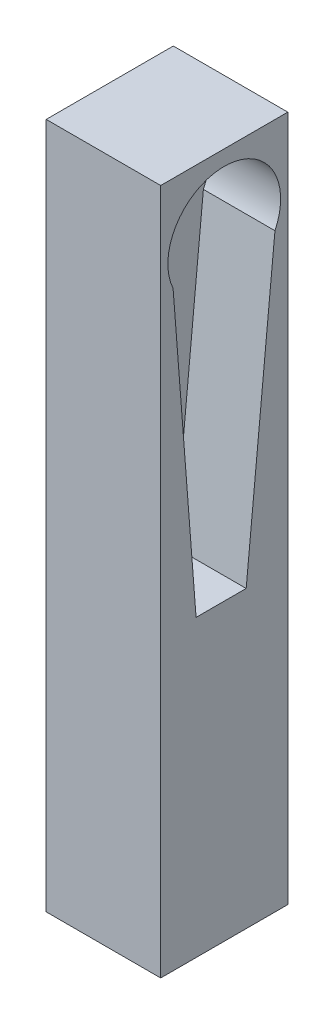
ISO-10303-21;
HEADER;
FILE_DESCRIPTION(('STEP AP214'),'2;1');
FILE_NAME('part.step','',(''),(''),'','','');
FILE_SCHEMA(('AUTOMOTIVE_DESIGN { 1 0 10303 214 1 1 1 1 }'));
ENDSEC;
DATA;
#1=APPLICATION_CONTEXT('core data for automotive mechanical design processes');
#2=APPLICATION_PROTOCOL_DEFINITION('international standard','automotive_design',2000,#1);
#3=PRODUCT_CONTEXT('',#1,'mechanical');
#4=PRODUCT('Part','Part','',(#3));
#5=PRODUCT_RELATED_PRODUCT_CATEGORY('part','',(#4));
#6=PRODUCT_DEFINITION_FORMATION('','',#4);
#7=PRODUCT_DEFINITION_CONTEXT('part definition',#1,'design');
#8=PRODUCT_DEFINITION('design','',#6,#7);
#9=PRODUCT_DEFINITION_SHAPE('','',#8);
#10=(LENGTH_UNIT() NAMED_UNIT(*) SI_UNIT(.MILLI.,.METRE.));
#11=(NAMED_UNIT(*) PLANE_ANGLE_UNIT() SI_UNIT($,.RADIAN.));
#12=(NAMED_UNIT(*) SI_UNIT($,.STERADIAN.) SOLID_ANGLE_UNIT());
#13=UNCERTAINTY_MEASURE_WITH_UNIT(LENGTH_MEASURE(1.E-05),#10,'distance_accuracy_value','');
#14=(GEOMETRIC_REPRESENTATION_CONTEXT(3) GLOBAL_UNCERTAINTY_ASSIGNED_CONTEXT((#13)) GLOBAL_UNIT_ASSIGNED_CONTEXT((#10,
#11,#12)) REPRESENTATION_CONTEXT('',''));
#15=CARTESIAN_POINT('',(0.,0.,0.));
#16=DIRECTION('',(0.,0.,1.));
#17=DIRECTION('',(1.,0.,0.));
#18=AXIS2_PLACEMENT_3D('',#15,#16,#17);
#19=CARTESIAN_POINT('',(8.,-0.285657863573996,3.68145381554616));
#20=DIRECTION('',(0.,0.0773612269140107,-0.99700312966929));
#21=DIRECTION('',(0.,0.99700312966929,0.0773612269140107));
#22=AXIS2_PLACEMENT_3D('',#19,#20,#21);
#23=PLANE('',#22);
#24=DIRECTION('',(0.,-0.99700312966929,-0.0773612269140107));
#25=VECTOR('',#24,1.);
#26=CARTESIAN_POINT('',(3.,-0.285657863573996,3.68145381554616));
#27=LINE('',#26,#25);
#28=CARTESIAN_POINT('',(3.,-1.6553290300342,3.57517587242551));
#29=VERTEX_POINT('',#28);
#30=CARTESIAN_POINT('',(3.,-22.3642227088041,1.96829483529892));
#31=VERTEX_POINT('',#30);
#32=EDGE_CURVE('E89',#29,#31,#27,.T.);
#33=ORIENTED_EDGE('',*,*,#32,.F.);
#34=DIRECTION('',(-1.,0.,0.));
#35=VECTOR('',#34,1.);
#36=CARTESIAN_POINT('',(8.,-1.6553290300342,3.57517587242551));
#37=LINE('',#36,#35);
#38=CARTESIAN_POINT('',(8.,-1.6553290300342,3.57517587242551));
#39=VERTEX_POINT('',#38);
#40=EDGE_CURVE('E12',#39,#29,#37,.T.);
#41=ORIENTED_EDGE('',*,*,#40,.F.);
#42=DIRECTION('',(0.,-0.99700312966929,-0.0773612269140107));
#43=VECTOR('',#42,1.);
#44=CARTESIAN_POINT('',(8.,-0.285657863573996,3.68145381554616));
#45=LINE('',#44,#43);
#46=CARTESIAN_POINT('',(8.,-22.3642227088041,1.96829483529892));
#47=VERTEX_POINT('',#46);
#48=EDGE_CURVE('E196',#39,#47,#45,.T.);
#49=ORIENTED_EDGE('',*,*,#48,.T.);
#50=DIRECTION('',(-1.,0.,0.));
#51=VECTOR('',#50,1.);
#52=CARTESIAN_POINT('',(8.,-22.3642227088041,1.96829483529892));
#53=LINE('',#52,#51);
#54=EDGE_CURVE('E207',#47,#31,#53,.T.);
#55=ORIENTED_EDGE('',*,*,#54,.T.);
#56=EDGE_LOOP('',(#33,#41,#49,#55));
#57=FACE_BOUND('',#56,.T.);
#58=ADVANCED_FACE('F75',(#57),#23,.T.);
#59=CARTESIAN_POINT('',(8.,0.,0.));
#60=DIRECTION('',(-1.,0.,0.));
#61=DIRECTION('',(0.,0.,1.));
#62=AXIS2_PLACEMENT_3D('',#59,#60,#61);
#63=CYLINDRICAL_SURFACE('',#62,3.93979653236655);
#64=ORIENTED_EDGE('',*,*,#40,.T.);
#65=CARTESIAN_POINT('',(3.,0.,0.));
#66=DIRECTION('',(1.,0.,0.));
#67=DIRECTION('',(0.,0.,-1.));
#68=AXIS2_PLACEMENT_3D('',#65,#66,#67);
#69=CIRCLE('',#68,3.93979653236655);
#70=CARTESIAN_POINT('',(3.,-1.72527742243439,-3.54195066765273));
#71=VERTEX_POINT('',#70);
#72=EDGE_CURVE('E184',#29,#71,#69,.F.);
#73=ORIENTED_EDGE('',*,*,#72,.T.);
#74=DIRECTION('',(-1.,0.,0.));
#75=VECTOR('',#74,1.);
#76=CARTESIAN_POINT('',(8.,-1.72527742243439,-3.54195066765273));
#77=LINE('',#76,#75);
#78=CARTESIAN_POINT('',(8.,-1.72527742243439,-3.54195066765273));
#79=VERTEX_POINT('',#78);
#80=EDGE_CURVE('E82',#79,#71,#77,.T.);
#81=ORIENTED_EDGE('',*,*,#80,.F.);
#82=CARTESIAN_POINT('',(8.,0.,0.));
#83=DIRECTION('',(1.,0.,0.));
#84=DIRECTION('',(0.,0.,-1.));
#85=AXIS2_PLACEMENT_3D('',#82,#83,#84);
#86=CIRCLE('',#85,3.93979653236655);
#87=EDGE_CURVE('E201',#39,#79,#86,.F.);
#88=ORIENTED_EDGE('',*,*,#87,.F.);
#89=EDGE_LOOP('',(#64,#73,#81,#88));
#90=FACE_BOUND('',#89,.T.);
#91=ADVANCED_FACE('F219',(#90),#63,.F.);
#92=CARTESIAN_POINT('',(8.,-0.357959667477983,-3.67512822735208));
#93=DIRECTION('',(0.,-0.096941840547844,-0.995290047951448));
#94=DIRECTION('',(0.,0.995290047951448,-0.096941840547844));
#95=AXIS2_PLACEMENT_3D('',#92,#93,#94);
#96=PLANE('',#95);
#97=ORIENTED_EDGE('',*,*,#80,.T.);
#98=DIRECTION('',(0.,-0.995290047951448,0.096941840547844));
#99=VECTOR('',#98,1.);
#100=CARTESIAN_POINT('',(3.,-0.357959667477983,-3.67512822735208));
#101=LINE('',#100,#99);
#102=CARTESIAN_POINT('',(3.,-22.3642227088041,-1.53170516470108));
#103=VERTEX_POINT('',#102);
#104=EDGE_CURVE('E190',#71,#103,#101,.T.);
#105=ORIENTED_EDGE('',*,*,#104,.T.);
#106=DIRECTION('',(-1.,0.,0.));
#107=VECTOR('',#106,1.);
#108=CARTESIAN_POINT('',(8.,-22.3642227088041,-1.53170516470108));
#109=LINE('',#108,#107);
#110=CARTESIAN_POINT('',(8.,-22.3642227088041,-1.53170516470108));
#111=VERTEX_POINT('',#110);
#112=EDGE_CURVE('E210',#111,#103,#109,.T.);
#113=ORIENTED_EDGE('',*,*,#112,.F.);
#114=DIRECTION('',(0.,-0.995290047951448,0.096941840547844));
#115=VECTOR('',#114,1.);
#116=CARTESIAN_POINT('',(8.,-0.357959667477983,-3.67512822735208));
#117=LINE('',#116,#115);
#118=EDGE_CURVE('E204',#79,#111,#117,.T.);
#119=ORIENTED_EDGE('',*,*,#118,.F.);
#120=EDGE_LOOP('',(#97,#105,#113,#119));
#121=FACE_BOUND('',#120,.T.);
#122=ADVANCED_FACE('F215',(#121),#96,.F.);
#123=CARTESIAN_POINT('',(8.,-22.3642227088041,0.));
#124=DIRECTION('',(0.,-1.,0.));
#125=DIRECTION('',(0.,0.,-1.));
#126=AXIS2_PLACEMENT_3D('',#123,#124,#125);
#127=PLANE('',#126);
#128=ORIENTED_EDGE('',*,*,#112,.T.);
#129=DIRECTION('',(0.,0.,1.));
#130=VECTOR('',#129,1.);
#131=CARTESIAN_POINT('',(3.,-22.3642227088041,0.));
#132=LINE('',#131,#130);
#133=EDGE_CURVE('E188',#103,#31,#132,.T.);
#134=ORIENTED_EDGE('',*,*,#133,.T.);
#135=ORIENTED_EDGE('',*,*,#54,.F.);
#136=DIRECTION('',(0.,0.,1.));
#137=VECTOR('',#136,1.);
#138=CARTESIAN_POINT('',(8.,-22.3642227088041,0.));
#139=LINE('',#138,#137);
#140=EDGE_CURVE('E97',#111,#47,#139,.T.);
#141=ORIENTED_EDGE('',*,*,#140,.F.);
#142=EDGE_LOOP('',(#128,#134,#135,#141));
#143=FACE_BOUND('',#142,.T.);
#144=ADVANCED_FACE('F224',(#143),#127,.F.);
#145=CARTESIAN_POINT('',(8.,0.,0.));
#146=DIRECTION('',(1.,0.,0.));
#147=DIRECTION('',(0.,0.,-1.));
#148=AXIS2_PLACEMENT_3D('',#145,#146,#147);
#149=PLANE('',#148);
#150=DIRECTION('',(0.,-1.,0.));
#151=VECTOR('',#150,1.);
#152=CARTESIAN_POINT('',(8.,0.,-4.43979653236655));
#153=LINE('',#152,#151);
#154=CARTESIAN_POINT('',(8.,5.00036123251668,-4.43979653236655));
#155=VERTEX_POINT('',#154);
#156=CARTESIAN_POINT('',(8.,-42.9467631339565,-4.43979653236655));
#157=VERTEX_POINT('',#156);
#158=EDGE_CURVE('E167',#155,#157,#153,.T.);
#159=ORIENTED_EDGE('',*,*,#158,.F.);
#160=DIRECTION('',(0.,0.,-1.));
#161=VECTOR('',#160,1.);
#162=CARTESIAN_POINT('',(8.,5.00036123251668,0.));
#163=LINE('',#162,#161);
#164=CARTESIAN_POINT('',(8.,5.00036123251668,4.43979653236654));
#165=VERTEX_POINT('',#164);
#166=EDGE_CURVE('E166',#165,#155,#163,.T.);
#167=ORIENTED_EDGE('',*,*,#166,.F.);
#168=DIRECTION('',(0.,-1.,0.));
#169=VECTOR('',#168,1.);
#170=CARTESIAN_POINT('',(8.,0.,4.43979653236654));
#171=LINE('',#170,#169);
#172=CARTESIAN_POINT('',(8.,-42.9467631339565,4.43979653236654));
#173=VERTEX_POINT('',#172);
#174=EDGE_CURVE('E169',#165,#173,#171,.T.);
#175=ORIENTED_EDGE('',*,*,#174,.T.);
#176=DIRECTION('',(0.,0.,-1.));
#177=VECTOR('',#176,1.);
#178=CARTESIAN_POINT('',(8.,-42.9467631339565,0.));
#179=LINE('',#178,#177);
#180=EDGE_CURVE('E178',#173,#157,#179,.T.);
#181=ORIENTED_EDGE('',*,*,#180,.T.);
#182=EDGE_LOOP('',(#159,#167,#175,#181));
#183=FACE_BOUND('',#182,.T.);
#184=ORIENTED_EDGE('',*,*,#48,.F.);
#185=ORIENTED_EDGE('',*,*,#87,.T.);
#186=ORIENTED_EDGE('',*,*,#118,.T.);
#187=ORIENTED_EDGE('',*,*,#140,.T.);
#188=EDGE_LOOP('',(#184,#185,#186,#187));
#189=FACE_BOUND('',#188,.T.);
#190=ADVANCED_FACE('F225',(#183,#189),#149,.T.);
#191=CARTESIAN_POINT('',(0.,0.,0.));
#192=DIRECTION('',(1.,0.,0.));
#193=DIRECTION('',(0.,0.,-1.));
#194=AXIS2_PLACEMENT_3D('',#191,#192,#193);
#195=PLANE('',#194);
#196=DIRECTION('',(0.,1.,0.));
#197=VECTOR('',#196,1.);
#198=CARTESIAN_POINT('',(0.,0.,4.43979653236654));
#199=LINE('',#198,#197);
#200=CARTESIAN_POINT('',(0.,-42.9467631339565,4.43979653236654));
#201=VERTEX_POINT('',#200);
#202=CARTESIAN_POINT('',(0.,5.00036123251668,4.43979653236654));
#203=VERTEX_POINT('',#202);
#204=EDGE_CURVE('E158',#201,#203,#199,.T.);
#205=ORIENTED_EDGE('',*,*,#204,.T.);
#206=DIRECTION('',(0.,0.,1.));
#207=VECTOR('',#206,1.);
#208=CARTESIAN_POINT('',(0.,5.00036123251668,0.));
#209=LINE('',#208,#207);
#210=CARTESIAN_POINT('',(0.,5.00036123251668,-4.43979653236655));
#211=VERTEX_POINT('',#210);
#212=EDGE_CURVE('E154',#211,#203,#209,.T.);
#213=ORIENTED_EDGE('',*,*,#212,.F.);
#214=DIRECTION('',(0.,1.,0.));
#215=VECTOR('',#214,1.);
#216=CARTESIAN_POINT('',(0.,0.,-4.43979653236655));
#217=LINE('',#216,#215);
#218=CARTESIAN_POINT('',(0.,-42.9467631339565,-4.43979653236655));
#219=VERTEX_POINT('',#218);
#220=EDGE_CURVE('E140',#219,#211,#217,.T.);
#221=ORIENTED_EDGE('',*,*,#220,.F.);
#222=DIRECTION('',(0.,0.,1.));
#223=VECTOR('',#222,1.);
#224=CARTESIAN_POINT('',(0.,-42.9467631339565,0.));
#225=LINE('',#224,#223);
#226=EDGE_CURVE('E151',#219,#201,#225,.T.);
#227=ORIENTED_EDGE('',*,*,#226,.T.);
#228=EDGE_LOOP('',(#205,#213,#221,#227));
#229=FACE_BOUND('',#228,.T.);
#230=CARTESIAN_POINT('',(0.,0.,0.));
#231=DIRECTION('',(1.,0.,0.));
#232=DIRECTION('',(0.,0.,-1.));
#233=AXIS2_PLACEMENT_3D('',#230,#231,#232);
#234=CIRCLE('',#233,1.5);
#235=CARTESIAN_POINT('',(0.,0.,-1.5));
#236=VERTEX_POINT('',#235);
#237=EDGE_CURVE('E150',#236,#236,#234,.T.);
#238=ORIENTED_EDGE('',*,*,#237,.T.);
#239=EDGE_LOOP('',(#238));
#240=FACE_BOUND('',#239,.T.);
#241=ADVANCED_FACE('F155',(#229,#240),#195,.F.);
#242=CARTESIAN_POINT('',(3.,0.,0.));
#243=DIRECTION('',(-1.,0.,0.));
#244=DIRECTION('',(0.,0.,1.));
#245=AXIS2_PLACEMENT_3D('',#242,#243,#244);
#246=CYLINDRICAL_SURFACE('',#245,1.5);
#247=CARTESIAN_POINT('',(3.,0.,0.));
#248=DIRECTION('',(1.,0.,0.));
#249=DIRECTION('',(0.,0.,-1.));
#250=AXIS2_PLACEMENT_3D('',#247,#248,#249);
#251=CIRCLE('',#250,1.5);
#252=CARTESIAN_POINT('',(3.,0.,-1.5));
#253=VERTEX_POINT('',#252);
#254=EDGE_CURVE('E193',#253,#253,#251,.T.);
#255=ORIENTED_EDGE('',*,*,#254,.T.);
#256=EDGE_LOOP('',(#255));
#257=FACE_BOUND('',#256,.T.);
#258=ORIENTED_EDGE('',*,*,#237,.F.);
#259=EDGE_LOOP('',(#258));
#260=FACE_BOUND('',#259,.T.);
#261=ADVANCED_FACE('F233',(#257,#260),#246,.F.);
#262=CARTESIAN_POINT('',(3.,0.,0.));
#263=DIRECTION('',(1.,0.,0.));
#264=DIRECTION('',(0.,0.,-1.));
#265=AXIS2_PLACEMENT_3D('',#262,#263,#264);
#266=PLANE('',#265);
#267=ORIENTED_EDGE('',*,*,#72,.F.);
#268=ORIENTED_EDGE('',*,*,#32,.T.);
#269=ORIENTED_EDGE('',*,*,#133,.F.);
#270=ORIENTED_EDGE('',*,*,#104,.F.);
#271=EDGE_LOOP('',(#267,#268,#269,#270));
#272=FACE_BOUND('',#271,.T.);
#273=ORIENTED_EDGE('',*,*,#254,.F.);
#274=EDGE_LOOP('',(#273));
#275=FACE_BOUND('',#274,.T.);
#276=ADVANCED_FACE('F220',(#272,#275),#266,.T.);
#277=CARTESIAN_POINT('',(-43.855120985803,0.,4.43979653236654));
#278=DIRECTION('',(0.,0.,1.));
#279=DIRECTION('',(0.,-1.,0.));
#280=AXIS2_PLACEMENT_3D('',#277,#278,#279);
#281=PLANE('',#280);
#282=ORIENTED_EDGE('',*,*,#204,.F.);
#283=DIRECTION('',(1.,0.,0.));
#284=VECTOR('',#283,1.);
#285=CARTESIAN_POINT('',(-43.855120985803,-42.9467631339565,4.43979653236654));
#286=LINE('',#285,#284);
#287=EDGE_CURVE('E181',#201,#173,#286,.T.);
#288=ORIENTED_EDGE('',*,*,#287,.T.);
#289=ORIENTED_EDGE('',*,*,#174,.F.);
#290=DIRECTION('',(1.,0.,0.));
#291=VECTOR('',#290,1.);
#292=CARTESIAN_POINT('',(-43.855120985803,5.00036123251668,4.43979653236654));
#293=LINE('',#292,#291);
#294=EDGE_CURVE('E162',#203,#165,#293,.T.);
#295=ORIENTED_EDGE('',*,*,#294,.F.);
#296=EDGE_LOOP('',(#282,#288,#289,#295));
#297=FACE_BOUND('',#296,.T.);
#298=ADVANCED_FACE('F269',(#297),#281,.T.);
#299=CARTESIAN_POINT('',(-43.855120985803,-42.9467631339565,0.));
#300=DIRECTION('',(0.,-1.,0.));
#301=DIRECTION('',(0.,0.,-1.));
#302=AXIS2_PLACEMENT_3D('',#299,#300,#301);
#303=PLANE('',#302);
#304=ORIENTED_EDGE('',*,*,#226,.F.);
#305=DIRECTION('',(1.,0.,0.));
#306=VECTOR('',#305,1.);
#307=CARTESIAN_POINT('',(-43.855120985803,-42.9467631339565,-4.43979653236655));
#308=LINE('',#307,#306);
#309=EDGE_CURVE('E147',#219,#157,#308,.T.);
#310=ORIENTED_EDGE('',*,*,#309,.T.);
#311=ORIENTED_EDGE('',*,*,#180,.F.);
#312=ORIENTED_EDGE('',*,*,#287,.F.);
#313=EDGE_LOOP('',(#304,#310,#311,#312));
#314=FACE_BOUND('',#313,.T.);
#315=ADVANCED_FACE('F293',(#314),#303,.T.);
#316=CARTESIAN_POINT('',(-43.855120985803,0.,-4.43979653236655));
#317=DIRECTION('',(0.,0.,1.));
#318=DIRECTION('',(0.,-1.,0.));
#319=AXIS2_PLACEMENT_3D('',#316,#317,#318);
#320=PLANE('',#319);
#321=ORIENTED_EDGE('',*,*,#309,.F.);
#322=ORIENTED_EDGE('',*,*,#220,.T.);
#323=DIRECTION('',(1.,0.,0.));
#324=VECTOR('',#323,1.);
#325=CARTESIAN_POINT('',(-43.855120985803,5.00036123251668,-4.43979653236655));
#326=LINE('',#325,#324);
#327=EDGE_CURVE('E145',#211,#155,#326,.T.);
#328=ORIENTED_EDGE('',*,*,#327,.T.);
#329=ORIENTED_EDGE('',*,*,#158,.T.);
#330=EDGE_LOOP('',(#321,#322,#328,#329));
#331=FACE_BOUND('',#330,.T.);
#332=ADVANCED_FACE('F142',(#331),#320,.F.);
#333=CARTESIAN_POINT('',(-43.855120985803,5.00036123251668,0.));
#334=DIRECTION('',(0.,-1.,0.));
#335=DIRECTION('',(0.,0.,-1.));
#336=AXIS2_PLACEMENT_3D('',#333,#334,#335);
#337=PLANE('',#336);
#338=ORIENTED_EDGE('',*,*,#327,.F.);
#339=ORIENTED_EDGE('',*,*,#212,.T.);
#340=ORIENTED_EDGE('',*,*,#294,.T.);
#341=ORIENTED_EDGE('',*,*,#166,.T.);
#342=EDGE_LOOP('',(#338,#339,#340,#341));
#343=FACE_BOUND('',#342,.T.);
#344=ADVANCED_FACE('F164',(#343),#337,.F.);
#345=CLOSED_SHELL('',(#58,#91,#122,#144,#190,#241,#261,#276,#298,#315,#332,#344));
#346=MANIFOLD_SOLID_BREP('B2',#345);
#347=ADVANCED_BREP_SHAPE_REPRESENTATION('',(#18,#346),#14);
#348=SHAPE_DEFINITION_REPRESENTATION(#9,#347);
ENDSEC;
END-ISO-10303-21;
